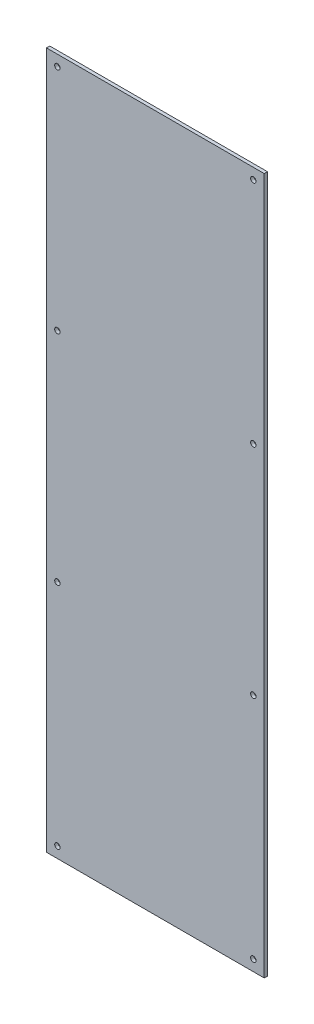
ISO-10303-21;
HEADER;
FILE_DESCRIPTION(('STEP AP214'),'2;1');
FILE_NAME('part.step','',(''),(''),'','','');
FILE_SCHEMA(('AUTOMOTIVE_DESIGN { 1 0 10303 214 1 1 1 1 }'));
ENDSEC;
DATA;
#1=APPLICATION_CONTEXT('core data for automotive mechanical design processes');
#2=APPLICATION_PROTOCOL_DEFINITION('international standard','automotive_design',2000,#1);
#3=PRODUCT_CONTEXT('',#1,'mechanical');
#4=PRODUCT('Part','Part','',(#3));
#5=PRODUCT_RELATED_PRODUCT_CATEGORY('part','',(#4));
#6=PRODUCT_DEFINITION_FORMATION('','',#4);
#7=PRODUCT_DEFINITION_CONTEXT('part definition',#1,'design');
#8=PRODUCT_DEFINITION('design','',#6,#7);
#9=PRODUCT_DEFINITION_SHAPE('','',#8);
#10=(LENGTH_UNIT() NAMED_UNIT(*) SI_UNIT(.MILLI.,.METRE.));
#11=(NAMED_UNIT(*) PLANE_ANGLE_UNIT() SI_UNIT($,.RADIAN.));
#12=(NAMED_UNIT(*) SI_UNIT($,.STERADIAN.) SOLID_ANGLE_UNIT());
#13=UNCERTAINTY_MEASURE_WITH_UNIT(LENGTH_MEASURE(1.E-05),#10,'distance_accuracy_value','');
#14=(GEOMETRIC_REPRESENTATION_CONTEXT(3) GLOBAL_UNCERTAINTY_ASSIGNED_CONTEXT((#13)) GLOBAL_UNIT_ASSIGNED_CONTEXT((#10,
#11,#12)) REPRESENTATION_CONTEXT('',''));
#15=CARTESIAN_POINT('',(0.,0.,0.));
#16=DIRECTION('',(0.,0.,1.));
#17=DIRECTION('',(1.,0.,0.));
#18=AXIS2_PLACEMENT_3D('',#15,#16,#17);
#19=CARTESIAN_POINT('',(-27.1074380165289,80.9917355371901,3.));
#20=DIRECTION('',(1.,0.,0.));
#21=DIRECTION('',(0.,1.,0.));
#22=AXIS2_PLACEMENT_3D('',#19,#20,#21);
#23=PLANE('',#22);
#24=DIRECTION('',(0.,-1.,0.));
#25=VECTOR('',#24,1.);
#26=CARTESIAN_POINT('',(-27.1074380165289,80.9917355371901,0.));
#27=LINE('',#26,#25);
#28=CARTESIAN_POINT('',(-27.1074380165289,80.9917355371901,0.));
#29=VERTEX_POINT('',#28);
#30=CARTESIAN_POINT('',(-27.1074380165288,-559.00826446281,0.));
#31=VERTEX_POINT('',#30);
#32=EDGE_CURVE('E96',#29,#31,#27,.T.);
#33=ORIENTED_EDGE('',*,*,#32,.T.);
#34=DIRECTION('',(0.,0.,-1.));
#35=VECTOR('',#34,1.);
#36=CARTESIAN_POINT('',(-27.1074380165288,-559.00826446281,3.));
#37=LINE('',#36,#35);
#38=CARTESIAN_POINT('',(-27.1074380165288,-559.00826446281,3.));
#39=VERTEX_POINT('',#38);
#40=EDGE_CURVE('E11',#39,#31,#37,.T.);
#41=ORIENTED_EDGE('',*,*,#40,.F.);
#42=DIRECTION('',(0.,-1.,0.));
#43=VECTOR('',#42,1.);
#44=CARTESIAN_POINT('',(-27.1074380165289,80.9917355371901,3.));
#45=LINE('',#44,#43);
#46=CARTESIAN_POINT('',(-27.1074380165289,80.9917355371901,3.));
#47=VERTEX_POINT('',#46);
#48=EDGE_CURVE('E84',#47,#39,#45,.T.);
#49=ORIENTED_EDGE('',*,*,#48,.F.);
#50=DIRECTION('',(0.,0.,-1.));
#51=VECTOR('',#50,1.);
#52=CARTESIAN_POINT('',(-27.1074380165289,80.9917355371901,3.));
#53=LINE('',#52,#51);
#54=EDGE_CURVE('E92',#47,#29,#53,.T.);
#55=ORIENTED_EDGE('',*,*,#54,.T.);
#56=EDGE_LOOP('',(#33,#41,#49,#55));
#57=FACE_BOUND('',#56,.T.);
#58=ADVANCED_FACE('F33',(#57),#23,.F.);
#59=CARTESIAN_POINT('',(-27.1074380165288,-559.00826446281,3.));
#60=DIRECTION('',(0.,1.,0.));
#61=DIRECTION('',(0.,0.,1.));
#62=AXIS2_PLACEMENT_3D('',#59,#60,#61);
#63=PLANE('',#62);
#64=DIRECTION('',(1.,0.,0.));
#65=VECTOR('',#64,1.);
#66=CARTESIAN_POINT('',(-27.1074380165288,-559.00826446281,0.));
#67=LINE('',#66,#65);
#68=CARTESIAN_POINT('',(172.892561983471,-559.00826446281,0.));
#69=VERTEX_POINT('',#68);
#70=EDGE_CURVE('E88',#31,#69,#67,.T.);
#71=ORIENTED_EDGE('',*,*,#70,.T.);
#72=DIRECTION('',(0.,0.,-1.));
#73=VECTOR('',#72,1.);
#74=CARTESIAN_POINT('',(172.892561983471,-559.00826446281,3.));
#75=LINE('',#74,#73);
#76=CARTESIAN_POINT('',(172.892561983471,-559.00826446281,3.));
#77=VERTEX_POINT('',#76);
#78=EDGE_CURVE('E41',#77,#69,#75,.T.);
#79=ORIENTED_EDGE('',*,*,#78,.F.);
#80=DIRECTION('',(1.,0.,0.));
#81=VECTOR('',#80,1.);
#82=CARTESIAN_POINT('',(-27.1074380165288,-559.00826446281,3.));
#83=LINE('',#82,#81);
#84=EDGE_CURVE('E79',#39,#77,#83,.T.);
#85=ORIENTED_EDGE('',*,*,#84,.F.);
#86=ORIENTED_EDGE('',*,*,#40,.T.);
#87=EDGE_LOOP('',(#71,#79,#85,#86));
#88=FACE_BOUND('',#87,.T.);
#89=ADVANCED_FACE('F87',(#88),#63,.F.);
#90=CARTESIAN_POINT('',(172.892561983471,80.9917355371901,3.));
#91=DIRECTION('',(-1.,0.,0.));
#92=DIRECTION('',(0.,-1.,0.));
#93=AXIS2_PLACEMENT_3D('',#90,#91,#92);
#94=PLANE('',#93);
#95=DIRECTION('',(0.,1.,0.));
#96=VECTOR('',#95,1.);
#97=CARTESIAN_POINT('',(172.892561983471,80.9917355371901,0.));
#98=LINE('',#97,#96);
#99=CARTESIAN_POINT('',(172.892561983471,80.9917355371901,0.));
#100=VERTEX_POINT('',#99);
#101=EDGE_CURVE('E66',#69,#100,#98,.T.);
#102=ORIENTED_EDGE('',*,*,#101,.T.);
#103=DIRECTION('',(0.,0.,-1.));
#104=VECTOR('',#103,1.);
#105=CARTESIAN_POINT('',(172.892561983471,80.9917355371901,3.));
#106=LINE('',#105,#104);
#107=CARTESIAN_POINT('',(172.892561983471,80.9917355371901,3.));
#108=VERTEX_POINT('',#107);
#109=EDGE_CURVE('E89',#108,#100,#106,.T.);
#110=ORIENTED_EDGE('',*,*,#109,.F.);
#111=DIRECTION('',(0.,1.,0.));
#112=VECTOR('',#111,1.);
#113=CARTESIAN_POINT('',(172.892561983471,80.9917355371901,3.));
#114=LINE('',#113,#112);
#115=EDGE_CURVE('E82',#77,#108,#114,.T.);
#116=ORIENTED_EDGE('',*,*,#115,.F.);
#117=ORIENTED_EDGE('',*,*,#78,.T.);
#118=EDGE_LOOP('',(#102,#110,#116,#117));
#119=FACE_BOUND('',#118,.T.);
#120=ADVANCED_FACE('F90',(#119),#94,.F.);
#121=CARTESIAN_POINT('',(-27.1074380165289,80.9917355371901,3.));
#122=DIRECTION('',(0.,-1.,0.));
#123=DIRECTION('',(0.,0.,-1.));
#124=AXIS2_PLACEMENT_3D('',#121,#122,#123);
#125=PLANE('',#124);
#126=DIRECTION('',(-1.,0.,0.));
#127=VECTOR('',#126,1.);
#128=CARTESIAN_POINT('',(-27.1074380165289,80.9917355371901,0.));
#129=LINE('',#128,#127);
#130=EDGE_CURVE('E72',#100,#29,#129,.T.);
#131=ORIENTED_EDGE('',*,*,#130,.T.);
#132=ORIENTED_EDGE('',*,*,#54,.F.);
#133=DIRECTION('',(-1.,0.,0.));
#134=VECTOR('',#133,1.);
#135=CARTESIAN_POINT('',(-27.1074380165289,80.9917355371901,3.));
#136=LINE('',#135,#134);
#137=EDGE_CURVE('E49',#108,#47,#136,.T.);
#138=ORIENTED_EDGE('',*,*,#137,.F.);
#139=ORIENTED_EDGE('',*,*,#109,.T.);
#140=EDGE_LOOP('',(#131,#132,#138,#139));
#141=FACE_BOUND('',#140,.T.);
#142=ADVANCED_FACE('F104',(#141),#125,.F.);
#143=CARTESIAN_POINT('',(0.,0.,3.));
#144=DIRECTION('',(0.,0.,1.));
#145=DIRECTION('',(1.,0.,0.));
#146=AXIS2_PLACEMENT_3D('',#143,#144,#145);
#147=PLANE('',#146);
#148=CARTESIAN_POINT('',(-17.1074380165289,70.9917355371901,3.));
#149=DIRECTION('',(0.,0.,1.));
#150=DIRECTION('',(1.,0.,0.));
#151=AXIS2_PLACEMENT_3D('',#148,#149,#150);
#152=CIRCLE('',#151,2.5);
#153=CARTESIAN_POINT('',(-14.6074380165289,70.9917355371901,3.));
#154=VERTEX_POINT('',#153);
#155=EDGE_CURVE('E128',#154,#154,#152,.T.);
#156=ORIENTED_EDGE('',*,*,#155,.F.);
#157=EDGE_LOOP('',(#156));
#158=FACE_BOUND('',#157,.T.);
#159=CARTESIAN_POINT('',(-17.1074380165289,-339.00826446281,3.));
#160=DIRECTION('',(0.,0.,1.));
#161=DIRECTION('',(1.,0.,0.));
#162=AXIS2_PLACEMENT_3D('',#159,#160,#161);
#163=CIRCLE('',#162,2.5);
#164=CARTESIAN_POINT('',(-14.6074380165289,-339.00826446281,3.));
#165=VERTEX_POINT('',#164);
#166=EDGE_CURVE('E135',#165,#165,#163,.T.);
#167=ORIENTED_EDGE('',*,*,#166,.F.);
#168=EDGE_LOOP('',(#167));
#169=FACE_BOUND('',#168,.T.);
#170=CARTESIAN_POINT('',(162.892561983471,70.9917355371902,3.));
#171=DIRECTION('',(0.,0.,1.));
#172=DIRECTION('',(1.,0.,0.));
#173=AXIS2_PLACEMENT_3D('',#170,#171,#172);
#174=CIRCLE('',#173,2.5);
#175=CARTESIAN_POINT('',(165.392561983471,70.9917355371902,3.));
#176=VERTEX_POINT('',#175);
#177=EDGE_CURVE('E116',#176,#176,#174,.T.);
#178=ORIENTED_EDGE('',*,*,#177,.F.);
#179=EDGE_LOOP('',(#178));
#180=FACE_BOUND('',#179,.T.);
#181=CARTESIAN_POINT('',(-17.1074380165289,-549.00826446281,3.));
#182=DIRECTION('',(0.,0.,1.));
#183=DIRECTION('',(1.,0.,0.));
#184=AXIS2_PLACEMENT_3D('',#181,#182,#183);
#185=CIRCLE('',#184,2.5);
#186=CARTESIAN_POINT('',(-14.6074380165289,-549.00826446281,3.));
#187=VERTEX_POINT('',#186);
#188=EDGE_CURVE('E123',#187,#187,#185,.T.);
#189=ORIENTED_EDGE('',*,*,#188,.F.);
#190=EDGE_LOOP('',(#189));
#191=FACE_BOUND('',#190,.T.);
#192=CARTESIAN_POINT('',(-17.1074380165289,-139.00826446281,3.));
#193=DIRECTION('',(0.,0.,1.));
#194=DIRECTION('',(1.,0.,0.));
#195=AXIS2_PLACEMENT_3D('',#192,#193,#194);
#196=CIRCLE('',#195,2.5);
#197=CARTESIAN_POINT('',(-14.6074380165289,-139.00826446281,3.));
#198=VERTEX_POINT('',#197);
#199=EDGE_CURVE('E152',#198,#198,#196,.T.);
#200=ORIENTED_EDGE('',*,*,#199,.F.);
#201=EDGE_LOOP('',(#200));
#202=FACE_BOUND('',#201,.T.);
#203=CARTESIAN_POINT('',(162.892561983471,-139.00826446281,3.));
#204=DIRECTION('',(0.,0.,1.));
#205=DIRECTION('',(1.,0.,0.));
#206=AXIS2_PLACEMENT_3D('',#203,#204,#205);
#207=CIRCLE('',#206,2.5);
#208=CARTESIAN_POINT('',(165.392561983471,-139.00826446281,3.));
#209=VERTEX_POINT('',#208);
#210=EDGE_CURVE('E146',#209,#209,#207,.T.);
#211=ORIENTED_EDGE('',*,*,#210,.F.);
#212=EDGE_LOOP('',(#211));
#213=FACE_BOUND('',#212,.T.);
#214=CARTESIAN_POINT('',(162.892561983471,-339.00826446281,3.));
#215=DIRECTION('',(0.,0.,1.));
#216=DIRECTION('',(1.,0.,0.));
#217=AXIS2_PLACEMENT_3D('',#214,#215,#216);
#218=CIRCLE('',#217,2.5);
#219=CARTESIAN_POINT('',(165.392561983471,-339.00826446281,3.));
#220=VERTEX_POINT('',#219);
#221=EDGE_CURVE('E140',#220,#220,#218,.T.);
#222=ORIENTED_EDGE('',*,*,#221,.F.);
#223=EDGE_LOOP('',(#222));
#224=FACE_BOUND('',#223,.T.);
#225=CARTESIAN_POINT('',(162.892561983471,-549.00826446281,3.));
#226=DIRECTION('',(0.,0.,1.));
#227=DIRECTION('',(1.,0.,0.));
#228=AXIS2_PLACEMENT_3D('',#225,#226,#227);
#229=CIRCLE('',#228,2.5);
#230=CARTESIAN_POINT('',(165.392561983471,-549.00826446281,3.));
#231=VERTEX_POINT('',#230);
#232=EDGE_CURVE('E110',#231,#231,#229,.T.);
#233=ORIENTED_EDGE('',*,*,#232,.F.);
#234=EDGE_LOOP('',(#233));
#235=FACE_BOUND('',#234,.T.);
#236=ORIENTED_EDGE('',*,*,#48,.T.);
#237=ORIENTED_EDGE('',*,*,#84,.T.);
#238=ORIENTED_EDGE('',*,*,#115,.T.);
#239=ORIENTED_EDGE('',*,*,#137,.T.);
#240=EDGE_LOOP('',(#236,#237,#238,#239));
#241=FACE_BOUND('',#240,.T.);
#242=ADVANCED_FACE('F80',(#158,#169,#180,#191,#202,#213,#224,#235,#241),#147,.T.);
#243=CARTESIAN_POINT('',(0.,0.,0.));
#244=DIRECTION('',(0.,0.,1.));
#245=DIRECTION('',(1.,0.,0.));
#246=AXIS2_PLACEMENT_3D('',#243,#244,#245);
#247=PLANE('',#246);
#248=CARTESIAN_POINT('',(-17.1074380165289,70.9917355371901,0.));
#249=DIRECTION('',(0.,0.,1.));
#250=DIRECTION('',(1.,0.,0.));
#251=AXIS2_PLACEMENT_3D('',#248,#249,#250);
#252=CIRCLE('',#251,2.5);
#253=CARTESIAN_POINT('',(-14.6074380165289,70.9917355371901,0.));
#254=VERTEX_POINT('',#253);
#255=EDGE_CURVE('E131',#254,#254,#252,.T.);
#256=ORIENTED_EDGE('',*,*,#255,.T.);
#257=EDGE_LOOP('',(#256));
#258=FACE_BOUND('',#257,.T.);
#259=CARTESIAN_POINT('',(-17.1074380165289,-339.00826446281,0.));
#260=DIRECTION('',(0.,0.,1.));
#261=DIRECTION('',(1.,0.,0.));
#262=AXIS2_PLACEMENT_3D('',#259,#260,#261);
#263=CIRCLE('',#262,2.5);
#264=CARTESIAN_POINT('',(-14.6074380165289,-339.00826446281,0.));
#265=VERTEX_POINT('',#264);
#266=EDGE_CURVE('E120',#265,#265,#263,.T.);
#267=ORIENTED_EDGE('',*,*,#266,.T.);
#268=EDGE_LOOP('',(#267));
#269=FACE_BOUND('',#268,.T.);
#270=CARTESIAN_POINT('',(162.892561983471,70.9917355371902,0.));
#271=DIRECTION('',(0.,0.,1.));
#272=DIRECTION('',(1.,0.,0.));
#273=AXIS2_PLACEMENT_3D('',#270,#271,#272);
#274=CIRCLE('',#273,2.5);
#275=CARTESIAN_POINT('',(165.392561983471,70.9917355371902,0.));
#276=VERTEX_POINT('',#275);
#277=EDGE_CURVE('E119',#276,#276,#274,.T.);
#278=ORIENTED_EDGE('',*,*,#277,.T.);
#279=EDGE_LOOP('',(#278));
#280=FACE_BOUND('',#279,.T.);
#281=CARTESIAN_POINT('',(-17.1074380165289,-549.00826446281,0.));
#282=DIRECTION('',(0.,0.,1.));
#283=DIRECTION('',(1.,0.,0.));
#284=AXIS2_PLACEMENT_3D('',#281,#282,#283);
#285=CIRCLE('',#284,2.5);
#286=CARTESIAN_POINT('',(-14.6074380165289,-549.00826446281,0.));
#287=VERTEX_POINT('',#286);
#288=EDGE_CURVE('E113',#287,#287,#285,.T.);
#289=ORIENTED_EDGE('',*,*,#288,.T.);
#290=EDGE_LOOP('',(#289));
#291=FACE_BOUND('',#290,.T.);
#292=CARTESIAN_POINT('',(-17.1074380165289,-139.00826446281,0.));
#293=DIRECTION('',(0.,0.,1.));
#294=DIRECTION('',(1.,0.,0.));
#295=AXIS2_PLACEMENT_3D('',#292,#293,#294);
#296=CIRCLE('',#295,2.5);
#297=CARTESIAN_POINT('',(-14.6074380165289,-139.00826446281,0.));
#298=VERTEX_POINT('',#297);
#299=EDGE_CURVE('E132',#298,#298,#296,.T.);
#300=ORIENTED_EDGE('',*,*,#299,.T.);
#301=EDGE_LOOP('',(#300));
#302=FACE_BOUND('',#301,.T.);
#303=CARTESIAN_POINT('',(162.892561983471,-139.00826446281,0.));
#304=DIRECTION('',(0.,0.,1.));
#305=DIRECTION('',(1.,0.,0.));
#306=AXIS2_PLACEMENT_3D('',#303,#304,#305);
#307=CIRCLE('',#306,2.5);
#308=CARTESIAN_POINT('',(165.392561983471,-139.00826446281,0.));
#309=VERTEX_POINT('',#308);
#310=EDGE_CURVE('E149',#309,#309,#307,.T.);
#311=ORIENTED_EDGE('',*,*,#310,.T.);
#312=EDGE_LOOP('',(#311));
#313=FACE_BOUND('',#312,.T.);
#314=CARTESIAN_POINT('',(162.892561983471,-339.00826446281,0.));
#315=DIRECTION('',(0.,0.,1.));
#316=DIRECTION('',(1.,0.,0.));
#317=AXIS2_PLACEMENT_3D('',#314,#315,#316);
#318=CIRCLE('',#317,2.5);
#319=CARTESIAN_POINT('',(165.392561983471,-339.00826446281,0.));
#320=VERTEX_POINT('',#319);
#321=EDGE_CURVE('E143',#320,#320,#318,.T.);
#322=ORIENTED_EDGE('',*,*,#321,.T.);
#323=EDGE_LOOP('',(#322));
#324=FACE_BOUND('',#323,.T.);
#325=CARTESIAN_POINT('',(162.892561983471,-549.00826446281,0.));
#326=DIRECTION('',(0.,0.,1.));
#327=DIRECTION('',(1.,0.,0.));
#328=AXIS2_PLACEMENT_3D('',#325,#326,#327);
#329=CIRCLE('',#328,2.5);
#330=CARTESIAN_POINT('',(165.392561983471,-549.00826446281,0.));
#331=VERTEX_POINT('',#330);
#332=EDGE_CURVE('E99',#331,#331,#329,.T.);
#333=ORIENTED_EDGE('',*,*,#332,.T.);
#334=EDGE_LOOP('',(#333));
#335=FACE_BOUND('',#334,.T.);
#336=ORIENTED_EDGE('',*,*,#32,.F.);
#337=ORIENTED_EDGE('',*,*,#130,.F.);
#338=ORIENTED_EDGE('',*,*,#101,.F.);
#339=ORIENTED_EDGE('',*,*,#70,.F.);
#340=EDGE_LOOP('',(#336,#337,#338,#339));
#341=FACE_BOUND('',#340,.T.);
#342=ADVANCED_FACE('F107',(#258,#269,#280,#291,#302,#313,#324,#335,#341),#247,.F.);
#343=CARTESIAN_POINT('',(162.892561983471,-549.00826446281,0.));
#344=DIRECTION('',(0.,0.,1.));
#345=DIRECTION('',(1.,0.,0.));
#346=AXIS2_PLACEMENT_3D('',#343,#344,#345);
#347=CYLINDRICAL_SURFACE('',#346,2.5);
#348=ORIENTED_EDGE('',*,*,#332,.F.);
#349=EDGE_LOOP('',(#348));
#350=FACE_BOUND('',#349,.T.);
#351=ORIENTED_EDGE('',*,*,#232,.T.);
#352=EDGE_LOOP('',(#351));
#353=FACE_BOUND('',#352,.T.);
#354=ADVANCED_FACE('F178',(#350,#353),#347,.F.);
#355=CARTESIAN_POINT('',(162.892561983471,-339.00826446281,0.));
#356=DIRECTION('',(0.,0.,1.));
#357=DIRECTION('',(1.,0.,0.));
#358=AXIS2_PLACEMENT_3D('',#355,#356,#357);
#359=CYLINDRICAL_SURFACE('',#358,2.5);
#360=ORIENTED_EDGE('',*,*,#321,.F.);
#361=EDGE_LOOP('',(#360));
#362=FACE_BOUND('',#361,.T.);
#363=ORIENTED_EDGE('',*,*,#221,.T.);
#364=EDGE_LOOP('',(#363));
#365=FACE_BOUND('',#364,.T.);
#366=ADVANCED_FACE('F180',(#362,#365),#359,.F.);
#367=CARTESIAN_POINT('',(162.892561983471,-139.00826446281,0.));
#368=DIRECTION('',(0.,0.,1.));
#369=DIRECTION('',(1.,0.,0.));
#370=AXIS2_PLACEMENT_3D('',#367,#368,#369);
#371=CYLINDRICAL_SURFACE('',#370,2.5);
#372=ORIENTED_EDGE('',*,*,#310,.F.);
#373=EDGE_LOOP('',(#372));
#374=FACE_BOUND('',#373,.T.);
#375=ORIENTED_EDGE('',*,*,#210,.T.);
#376=EDGE_LOOP('',(#375));
#377=FACE_BOUND('',#376,.T.);
#378=ADVANCED_FACE('F164',(#374,#377),#371,.F.);
#379=CARTESIAN_POINT('',(-17.1074380165289,-139.00826446281,0.));
#380=DIRECTION('',(0.,0.,1.));
#381=DIRECTION('',(1.,0.,0.));
#382=AXIS2_PLACEMENT_3D('',#379,#380,#381);
#383=CYLINDRICAL_SURFACE('',#382,2.5);
#384=ORIENTED_EDGE('',*,*,#299,.F.);
#385=EDGE_LOOP('',(#384));
#386=FACE_BOUND('',#385,.T.);
#387=ORIENTED_EDGE('',*,*,#199,.T.);
#388=EDGE_LOOP('',(#387));
#389=FACE_BOUND('',#388,.T.);
#390=ADVANCED_FACE('F160',(#386,#389),#383,.F.);
#391=CARTESIAN_POINT('',(-17.1074380165289,-549.00826446281,0.));
#392=DIRECTION('',(0.,0.,1.));
#393=DIRECTION('',(1.,0.,0.));
#394=AXIS2_PLACEMENT_3D('',#391,#392,#393);
#395=CYLINDRICAL_SURFACE('',#394,2.5);
#396=ORIENTED_EDGE('',*,*,#288,.F.);
#397=EDGE_LOOP('',(#396));
#398=FACE_BOUND('',#397,.T.);
#399=ORIENTED_EDGE('',*,*,#188,.T.);
#400=EDGE_LOOP('',(#399));
#401=FACE_BOUND('',#400,.T.);
#402=ADVANCED_FACE('F163',(#398,#401),#395,.F.);
#403=CARTESIAN_POINT('',(162.892561983471,70.9917355371902,0.));
#404=DIRECTION('',(0.,0.,1.));
#405=DIRECTION('',(1.,0.,0.));
#406=AXIS2_PLACEMENT_3D('',#403,#404,#405);
#407=CYLINDRICAL_SURFACE('',#406,2.5);
#408=ORIENTED_EDGE('',*,*,#277,.F.);
#409=EDGE_LOOP('',(#408));
#410=FACE_BOUND('',#409,.T.);
#411=ORIENTED_EDGE('',*,*,#177,.T.);
#412=EDGE_LOOP('',(#411));
#413=FACE_BOUND('',#412,.T.);
#414=ADVANCED_FACE('F249',(#410,#413),#407,.F.);
#415=CARTESIAN_POINT('',(-17.1074380165289,-339.00826446281,0.));
#416=DIRECTION('',(0.,0.,1.));
#417=DIRECTION('',(1.,0.,0.));
#418=AXIS2_PLACEMENT_3D('',#415,#416,#417);
#419=CYLINDRICAL_SURFACE('',#418,2.5);
#420=ORIENTED_EDGE('',*,*,#266,.F.);
#421=EDGE_LOOP('',(#420));
#422=FACE_BOUND('',#421,.T.);
#423=ORIENTED_EDGE('',*,*,#166,.T.);
#424=EDGE_LOOP('',(#423));
#425=FACE_BOUND('',#424,.T.);
#426=ADVANCED_FACE('F259',(#422,#425),#419,.F.);
#427=CARTESIAN_POINT('',(-17.1074380165289,70.9917355371901,0.));
#428=DIRECTION('',(0.,0.,1.));
#429=DIRECTION('',(1.,0.,0.));
#430=AXIS2_PLACEMENT_3D('',#427,#428,#429);
#431=CYLINDRICAL_SURFACE('',#430,2.5);
#432=ORIENTED_EDGE('',*,*,#255,.F.);
#433=EDGE_LOOP('',(#432));
#434=FACE_BOUND('',#433,.T.);
#435=ORIENTED_EDGE('',*,*,#155,.T.);
#436=EDGE_LOOP('',(#435));
#437=FACE_BOUND('',#436,.T.);
#438=ADVANCED_FACE('F268',(#434,#437),#431,.F.);
#439=CLOSED_SHELL('',(#58,#89,#120,#142,#242,#342,#354,#366,#378,#390,#402,#414,#426,#438));
#440=MANIFOLD_SOLID_BREP('B2',#439);
#441=ADVANCED_BREP_SHAPE_REPRESENTATION('',(#18,#440),#14);
#442=SHAPE_DEFINITION_REPRESENTATION(#9,#441);
ENDSEC;
END-ISO-10303-21;
